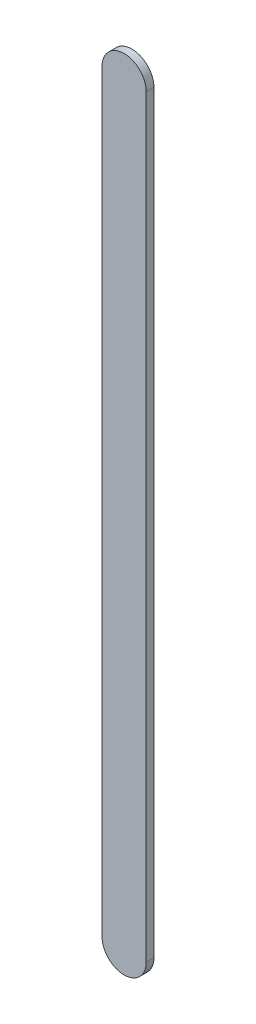
ISO-10303-21;
HEADER;
FILE_DESCRIPTION(('STEP AP214'),'2;1');
FILE_NAME('part.step','',(''),(''),'','','');
FILE_SCHEMA(('AUTOMOTIVE_DESIGN { 1 0 10303 214 1 1 1 1 }'));
ENDSEC;
DATA;
#1=APPLICATION_CONTEXT('core data for automotive mechanical design processes');
#2=APPLICATION_PROTOCOL_DEFINITION('international standard','automotive_design',2000,#1);
#3=PRODUCT_CONTEXT('',#1,'mechanical');
#4=PRODUCT('Part','Part','',(#3));
#5=PRODUCT_RELATED_PRODUCT_CATEGORY('part','',(#4));
#6=PRODUCT_DEFINITION_FORMATION('','',#4);
#7=PRODUCT_DEFINITION_CONTEXT('part definition',#1,'design');
#8=PRODUCT_DEFINITION('design','',#6,#7);
#9=PRODUCT_DEFINITION_SHAPE('','',#8);
#10=(LENGTH_UNIT() NAMED_UNIT(*) SI_UNIT(.MILLI.,.METRE.));
#11=(NAMED_UNIT(*) PLANE_ANGLE_UNIT() SI_UNIT($,.RADIAN.));
#12=(NAMED_UNIT(*) SI_UNIT($,.STERADIAN.) SOLID_ANGLE_UNIT());
#13=UNCERTAINTY_MEASURE_WITH_UNIT(LENGTH_MEASURE(1.E-05),#10,'distance_accuracy_value','');
#14=(GEOMETRIC_REPRESENTATION_CONTEXT(3) GLOBAL_UNCERTAINTY_ASSIGNED_CONTEXT((#13)) GLOBAL_UNIT_ASSIGNED_CONTEXT((#10,
#11,#12)) REPRESENTATION_CONTEXT('',''));
#15=CARTESIAN_POINT('',(0.,0.,0.));
#16=DIRECTION('',(0.,0.,1.));
#17=DIRECTION('',(1.,0.,0.));
#18=AXIS2_PLACEMENT_3D('',#15,#16,#17);
#19=CARTESIAN_POINT('',(82.35,-113.3375,1.635));
#20=DIRECTION('',(0.,0.,1.));
#21=DIRECTION('',(1.,0.,0.));
#22=AXIS2_PLACEMENT_3D('',#19,#20,#21);
#23=PLANE('',#22);
#24=DIRECTION('',(0.,-1.,0.));
#25=VECTOR('',#24,1.);
#26=CARTESIAN_POINT('',(82.35,-113.3375,1.635));
#27=LINE('',#26,#25);
#28=CARTESIAN_POINT('',(82.35,-113.3375,1.635));
#29=VERTEX_POINT('',#28);
#30=CARTESIAN_POINT('',(82.35,-116.75,1.635));
#31=VERTEX_POINT('',#30);
#32=EDGE_CURVE('E93',#29,#31,#27,.T.);
#33=ORIENTED_EDGE('',*,*,#32,.T.);
#34=CARTESIAN_POINT('',(82.45,-116.75,1.635));
#35=DIRECTION('',(0.,0.,1.));
#36=DIRECTION('',(-1.,0.,0.));
#37=AXIS2_PLACEMENT_3D('',#34,#35,#36);
#38=CIRCLE('',#37,0.1);
#39=CARTESIAN_POINT('',(82.55,-116.75,1.635));
#40=VERTEX_POINT('',#39);
#41=EDGE_CURVE('E73',#31,#40,#38,.T.);
#42=ORIENTED_EDGE('',*,*,#41,.T.);
#43=DIRECTION('',(0.,1.,0.));
#44=VECTOR('',#43,1.);
#45=CARTESIAN_POINT('',(82.55,-116.75,1.635));
#46=LINE('',#45,#44);
#47=CARTESIAN_POINT('',(82.55,-113.3375,1.635));
#48=VERTEX_POINT('',#47);
#49=EDGE_CURVE('E87',#40,#48,#46,.T.);
#50=ORIENTED_EDGE('',*,*,#49,.T.);
#51=CARTESIAN_POINT('',(82.45,-113.3375,1.635));
#52=DIRECTION('',(0.,0.,1.));
#53=DIRECTION('',(1.,-1.42108547152E-13,0.));
#54=AXIS2_PLACEMENT_3D('',#51,#52,#53);
#55=CIRCLE('',#54,0.1);
#56=EDGE_CURVE('E11',#48,#29,#55,.T.);
#57=ORIENTED_EDGE('',*,*,#56,.T.);
#58=EDGE_LOOP('',(#33,#42,#50,#57));
#59=FACE_BOUND('',#58,.T.);
#60=ADVANCED_FACE('F17',(#59),#23,.T.);
#61=CARTESIAN_POINT('',(82.35,-113.3375,1.6));
#62=DIRECTION('',(0.,0.,1.));
#63=DIRECTION('',(1.,0.,0.));
#64=AXIS2_PLACEMENT_3D('',#61,#62,#63);
#65=PLANE('',#64);
#66=CARTESIAN_POINT('',(82.45,-113.3375,1.6));
#67=DIRECTION('',(0.,0.,1.));
#68=DIRECTION('',(1.,-1.42108547152E-13,0.));
#69=AXIS2_PLACEMENT_3D('',#66,#67,#68);
#70=CIRCLE('',#69,0.1);
#71=CARTESIAN_POINT('',(82.55,-113.3375,1.6));
#72=VERTEX_POINT('',#71);
#73=CARTESIAN_POINT('',(82.35,-113.3375,1.6));
#74=VERTEX_POINT('',#73);
#75=EDGE_CURVE('E20',#72,#74,#70,.T.);
#76=ORIENTED_EDGE('',*,*,#75,.F.);
#77=DIRECTION('',(0.,1.,0.));
#78=VECTOR('',#77,1.);
#79=CARTESIAN_POINT('',(82.55,-116.75,1.6));
#80=LINE('',#79,#78);
#81=CARTESIAN_POINT('',(82.55,-116.75,1.6));
#82=VERTEX_POINT('',#81);
#83=EDGE_CURVE('E58',#82,#72,#80,.T.);
#84=ORIENTED_EDGE('',*,*,#83,.F.);
#85=CARTESIAN_POINT('',(82.45,-116.75,1.6));
#86=DIRECTION('',(0.,0.,1.));
#87=DIRECTION('',(-1.,0.,0.));
#88=AXIS2_PLACEMENT_3D('',#85,#86,#87);
#89=CIRCLE('',#88,0.1);
#90=CARTESIAN_POINT('',(82.35,-116.75,1.6));
#91=VERTEX_POINT('',#90);
#92=EDGE_CURVE('E95',#91,#82,#89,.T.);
#93=ORIENTED_EDGE('',*,*,#92,.F.);
#94=DIRECTION('',(0.,-1.,0.));
#95=VECTOR('',#94,1.);
#96=CARTESIAN_POINT('',(82.35,-113.3375,1.6));
#97=LINE('',#96,#95);
#98=EDGE_CURVE('E92',#74,#91,#97,.T.);
#99=ORIENTED_EDGE('',*,*,#98,.F.);
#100=EDGE_LOOP('',(#76,#84,#93,#99));
#101=FACE_BOUND('',#100,.T.);
#102=ADVANCED_FACE('F97',(#101),#65,.F.);
#103=CARTESIAN_POINT('',(82.45,-113.3375,1.6));
#104=DIRECTION('',(0.,0.,-1.));
#105=DIRECTION('',(1.,-1.42108547152E-13,0.));
#106=AXIS2_PLACEMENT_3D('',#103,#104,#105);
#107=CYLINDRICAL_SURFACE('',#106,0.1);
#108=ORIENTED_EDGE('',*,*,#75,.T.);
#109=DIRECTION('',(0.,0.,1.));
#110=VECTOR('',#109,1.);
#111=CARTESIAN_POINT('',(82.35,-113.3375,1.6));
#112=LINE('',#111,#110);
#113=EDGE_CURVE('E82',#74,#29,#112,.T.);
#114=ORIENTED_EDGE('',*,*,#113,.T.);
#115=ORIENTED_EDGE('',*,*,#56,.F.);
#116=DIRECTION('',(0.,0.,1.));
#117=VECTOR('',#116,1.);
#118=CARTESIAN_POINT('',(82.55,-113.3375,1.6));
#119=LINE('',#118,#117);
#120=EDGE_CURVE('E85',#72,#48,#119,.T.);
#121=ORIENTED_EDGE('',*,*,#120,.F.);
#122=EDGE_LOOP('',(#108,#114,#115,#121));
#123=FACE_BOUND('',#122,.T.);
#124=ADVANCED_FACE('F81',(#123),#107,.T.);
#125=CARTESIAN_POINT('',(82.55,-116.75,1.6));
#126=DIRECTION('',(-1.,0.,0.));
#127=DIRECTION('',(0.,0.,1.));
#128=AXIS2_PLACEMENT_3D('',#125,#126,#127);
#129=PLANE('',#128);
#130=ORIENTED_EDGE('',*,*,#83,.T.);
#131=ORIENTED_EDGE('',*,*,#120,.T.);
#132=ORIENTED_EDGE('',*,*,#49,.F.);
#133=DIRECTION('',(0.,0.,1.));
#134=VECTOR('',#133,1.);
#135=CARTESIAN_POINT('',(82.55,-116.75,1.6));
#136=LINE('',#135,#134);
#137=EDGE_CURVE('E114',#82,#40,#136,.T.);
#138=ORIENTED_EDGE('',*,*,#137,.F.);
#139=EDGE_LOOP('',(#130,#131,#132,#138));
#140=FACE_BOUND('',#139,.T.);
#141=ADVANCED_FACE('F124',(#140),#129,.F.);
#142=CARTESIAN_POINT('',(82.45,-116.75,1.6));
#143=DIRECTION('',(0.,0.,-1.));
#144=DIRECTION('',(-1.,0.,0.));
#145=AXIS2_PLACEMENT_3D('',#142,#143,#144);
#146=CYLINDRICAL_SURFACE('',#145,0.1);
#147=ORIENTED_EDGE('',*,*,#92,.T.);
#148=ORIENTED_EDGE('',*,*,#137,.T.);
#149=ORIENTED_EDGE('',*,*,#41,.F.);
#150=DIRECTION('',(0.,0.,1.));
#151=VECTOR('',#150,1.);
#152=CARTESIAN_POINT('',(82.35,-116.75,1.6));
#153=LINE('',#152,#151);
#154=EDGE_CURVE('E100',#91,#31,#153,.T.);
#155=ORIENTED_EDGE('',*,*,#154,.F.);
#156=EDGE_LOOP('',(#147,#148,#149,#155));
#157=FACE_BOUND('',#156,.T.);
#158=ADVANCED_FACE('F125',(#157),#146,.T.);
#159=CARTESIAN_POINT('',(82.35,-113.3375,1.6));
#160=DIRECTION('',(1.,0.,0.));
#161=DIRECTION('',(0.,1.,0.));
#162=AXIS2_PLACEMENT_3D('',#159,#160,#161);
#163=PLANE('',#162);
#164=ORIENTED_EDGE('',*,*,#98,.T.);
#165=ORIENTED_EDGE('',*,*,#154,.T.);
#166=ORIENTED_EDGE('',*,*,#32,.F.);
#167=ORIENTED_EDGE('',*,*,#113,.F.);
#168=EDGE_LOOP('',(#164,#165,#166,#167));
#169=FACE_BOUND('',#168,.T.);
#170=ADVANCED_FACE('F90',(#169),#163,.F.);
#171=CLOSED_SHELL('',(#60,#102,#124,#141,#158,#170));
#172=MANIFOLD_SOLID_BREP('B1',#171);
#173=ADVANCED_BREP_SHAPE_REPRESENTATION('',(#18,#172),#14);
#174=SHAPE_DEFINITION_REPRESENTATION(#9,#173);
ENDSEC;
END-ISO-10303-21;
